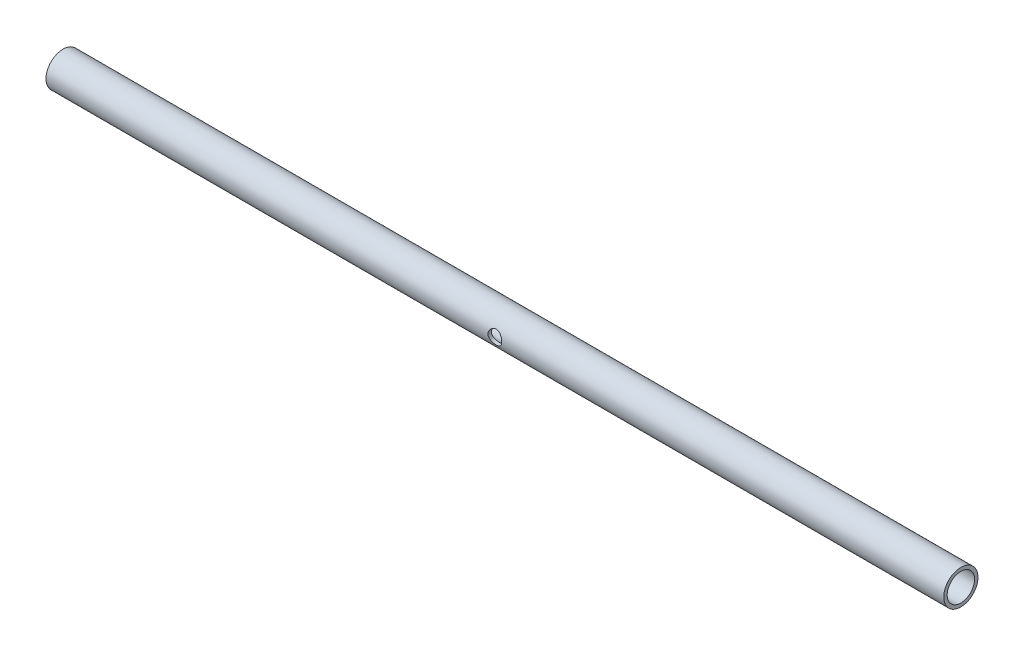
ISO-10303-21;
HEADER;
FILE_DESCRIPTION(('STEP AP214'),'2;1');
FILE_NAME('part.step','',(''),(''),'','','');
FILE_SCHEMA(('AUTOMOTIVE_DESIGN { 1 0 10303 214 1 1 1 1 }'));
ENDSEC;
DATA;
#1=APPLICATION_CONTEXT('core data for automotive mechanical design processes');
#2=APPLICATION_PROTOCOL_DEFINITION('international standard','automotive_design',2000,#1);
#3=PRODUCT_CONTEXT('',#1,'mechanical');
#4=PRODUCT('Part','Part','',(#3));
#5=PRODUCT_RELATED_PRODUCT_CATEGORY('part','',(#4));
#6=PRODUCT_DEFINITION_FORMATION('','',#4);
#7=PRODUCT_DEFINITION_CONTEXT('part definition',#1,'design');
#8=PRODUCT_DEFINITION('design','',#6,#7);
#9=PRODUCT_DEFINITION_SHAPE('','',#8);
#10=(LENGTH_UNIT() NAMED_UNIT(*) SI_UNIT(.MILLI.,.METRE.));
#11=(NAMED_UNIT(*) PLANE_ANGLE_UNIT() SI_UNIT($,.RADIAN.));
#12=(NAMED_UNIT(*) SI_UNIT($,.STERADIAN.) SOLID_ANGLE_UNIT());
#13=UNCERTAINTY_MEASURE_WITH_UNIT(LENGTH_MEASURE(1.E-05),#10,'distance_accuracy_value','');
#14=(GEOMETRIC_REPRESENTATION_CONTEXT(3) GLOBAL_UNCERTAINTY_ASSIGNED_CONTEXT((#13)) GLOBAL_UNIT_ASSIGNED_CONTEXT((#10,
#11,#12)) REPRESENTATION_CONTEXT('',''));
#15=CARTESIAN_POINT('',(0.,0.,0.));
#16=DIRECTION('',(0.,0.,1.));
#17=DIRECTION('',(1.,0.,0.));
#18=AXIS2_PLACEMENT_3D('',#15,#16,#17);
#19=CARTESIAN_POINT('',(131.,0.,0.));
#20=DIRECTION('',(1.,0.,0.));
#21=DIRECTION('',(0.,0.,-1.));
#22=AXIS2_PLACEMENT_3D('',#19,#20,#21);
#23=PLANE('',#22);
#24=CARTESIAN_POINT('',(131.,0.,0.));
#25=DIRECTION('',(1.,0.,0.));
#26=DIRECTION('',(0.,0.,-1.));
#27=AXIS2_PLACEMENT_3D('',#24,#25,#26);
#28=CIRCLE('',#27,5.);
#29=CARTESIAN_POINT('',(131.,0.,-5.));
#30=VERTEX_POINT('',#29);
#31=EDGE_CURVE('E10',#30,#30,#28,.T.);
#32=ORIENTED_EDGE('',*,*,#31,.T.);
#33=EDGE_LOOP('',(#32));
#34=FACE_BOUND('',#33,.T.);
#35=CARTESIAN_POINT('',(131.,0.,0.));
#36=DIRECTION('',(1.,0.,0.));
#37=DIRECTION('',(0.,0.,-1.));
#38=AXIS2_PLACEMENT_3D('',#35,#36,#37);
#39=CIRCLE('',#38,4.);
#40=CARTESIAN_POINT('',(131.,0.,-4.));
#41=VERTEX_POINT('',#40);
#42=EDGE_CURVE('E55',#41,#41,#39,.T.);
#43=ORIENTED_EDGE('',*,*,#42,.F.);
#44=EDGE_LOOP('',(#43));
#45=FACE_BOUND('',#44,.T.);
#46=ADVANCED_FACE('F36',(#34,#45),#23,.T.);
#47=CARTESIAN_POINT('',(-131.,0.,0.));
#48=DIRECTION('',(1.,0.,0.));
#49=DIRECTION('',(0.,0.,-1.));
#50=AXIS2_PLACEMENT_3D('',#47,#48,#49);
#51=PLANE('',#50);
#52=CARTESIAN_POINT('',(-131.,0.,0.));
#53=DIRECTION('',(1.,0.,0.));
#54=DIRECTION('',(0.,0.,-1.));
#55=AXIS2_PLACEMENT_3D('',#52,#53,#54);
#56=CIRCLE('',#55,5.);
#57=CARTESIAN_POINT('',(-131.,0.,-5.));
#58=VERTEX_POINT('',#57);
#59=EDGE_CURVE('E50',#58,#58,#56,.T.);
#60=ORIENTED_EDGE('',*,*,#59,.F.);
#61=EDGE_LOOP('',(#60));
#62=FACE_BOUND('',#61,.T.);
#63=CARTESIAN_POINT('',(-131.,0.,0.));
#64=DIRECTION('',(1.,0.,0.));
#65=DIRECTION('',(0.,0.,-1.));
#66=AXIS2_PLACEMENT_3D('',#63,#64,#65);
#67=CIRCLE('',#66,4.);
#68=CARTESIAN_POINT('',(-131.,0.,-4.));
#69=VERTEX_POINT('',#68);
#70=EDGE_CURVE('E58',#69,#69,#67,.T.);
#71=ORIENTED_EDGE('',*,*,#70,.T.);
#72=EDGE_LOOP('',(#71));
#73=FACE_BOUND('',#72,.T.);
#74=ADVANCED_FACE('F94',(#62,#73),#51,.F.);
#75=CARTESIAN_POINT('',(131.,0.,0.));
#76=DIRECTION('',(-1.,0.,0.));
#77=DIRECTION('',(0.,0.,1.));
#78=AXIS2_PLACEMENT_3D('',#75,#76,#77);
#79=CYLINDRICAL_SURFACE('',#78,5.);
#80=CARTESIAN_POINT('',(2.,0.,-5.));
#81=CARTESIAN_POINT('',(1.99999014817627,0.107493005442891,-4.99999271227085));
#82=CARTESIAN_POINT('',(1.99128224791162,0.215172564090673,-4.99649294306932));
#83=CARTESIAN_POINT('',(1.95675229647876,0.427496480417896,-4.98283453100641));
#84=CARTESIAN_POINT('',(1.93088372091387,0.532131777561248,-4.97265778698877));
#85=CARTESIAN_POINT('',(1.86312392194117,0.734953922727403,-4.94674209213118));
#86=CARTESIAN_POINT('',(1.82128515378327,0.833160661616959,-4.93102136364072));
#87=CARTESIAN_POINT('',(1.72298082667345,1.02107197032837,-4.89556610796078));
#88=CARTESIAN_POINT('',(1.66652034508107,1.11077947675099,-4.87583297458057));
#89=CARTESIAN_POINT('',(1.53776450143906,1.28350100757039,-4.83330886170419));
#90=CARTESIAN_POINT('',(1.46489334375974,1.36606227255021,-4.8104229692919));
#91=CARTESIAN_POINT('',(1.30659999652322,1.51817500478472,-4.76460576906194));
#92=CARTESIAN_POINT('',(1.22117170278826,1.58772010713353,-4.74167444453792));
#93=CARTESIAN_POINT('',(1.03557192975773,1.71487456729288,-4.69722791797136));
#94=CARTESIAN_POINT('',(0.934913513976802,1.77181498119547,-4.67582115964951));
#95=CARTESIAN_POINT('',(0.724463601579958,1.86775471903715,-4.63833647186793));
#96=CARTESIAN_POINT('',(0.614676472151639,1.90676256428583,-4.62225601244176));
#97=CARTESIAN_POINT('',(0.394287666407897,1.96389882339587,-4.59826357660818));
#98=CARTESIAN_POINT('',(0.283948764423787,1.98289396580565,-4.59001420355605));
#99=CARTESIAN_POINT('',(0.0613650016927322,2.00217296164003,-4.58164004049144));
#100=CARTESIAN_POINT('',(-0.0508788946250149,2.00246601631322,-4.58151125522768));
#101=CARTESIAN_POINT('',(-0.265756671458044,1.98498936750454,-4.58910500279994));
#102=CARTESIAN_POINT('',(-0.368515714409031,1.96847531430514,-4.5962817503845));
#103=CARTESIAN_POINT('',(-0.569659556006714,1.91994688029782,-4.61676187607836));
#104=CARTESIAN_POINT('',(-0.668043588110308,1.88792979480463,-4.63006632321673));
#105=CARTESIAN_POINT('',(-0.860017836196041,1.80869473255107,-4.6615948508853));
#106=CARTESIAN_POINT('',(-0.95346923905469,1.76117986231532,-4.67991379280788));
#107=CARTESIAN_POINT('',(-1.13141581636156,1.65250646073221,-4.7193811638989));
#108=CARTESIAN_POINT('',(-1.21590760940281,1.59134280510084,-4.74053065456848));
#109=CARTESIAN_POINT('',(-1.380409728802,1.45155059945443,-4.78526736742271));
#110=CARTESIAN_POINT('',(-1.45956872944602,1.37193746297063,-4.80891664976152));
#111=CARTESIAN_POINT('',(-1.60368447800204,1.20031442743019,-4.85459824958282));
#112=CARTESIAN_POINT('',(-1.66863839741029,1.10830206533443,-4.87663024445325));
#113=CARTESIAN_POINT('',(-1.78361744741583,0.912077652605842,-4.91714681264548));
#114=CARTESIAN_POINT('',(-1.83332228119705,0.807660491346477,-4.93555270095415));
#115=CARTESIAN_POINT('',(-1.91416786107806,0.591023765482882,-4.96614828328759));
#116=CARTESIAN_POINT('',(-1.94531803755741,0.478808196849674,-4.97834113462382));
#117=CARTESIAN_POINT('',(-1.9864482954197,0.25689588760782,-4.99456139506911));
#118=CARTESIAN_POINT('',(-1.99757245425356,0.147443293985535,-4.99902945833514));
#119=CARTESIAN_POINT('',(-2.00171310052861,-0.0718453098078171,-5.00068478510631));
#120=CARTESIAN_POINT('',(-1.99473428154751,-0.181681213223923,-4.99787393582291));
#121=CARTESIAN_POINT('',(-1.96370824744801,-0.393432739121987,-4.98557567063753));
#122=CARTESIAN_POINT('',(-1.94044201964902,-0.495482491775474,-4.97639391345523));
#123=CARTESIAN_POINT('',(-1.87856429169019,-0.69413542806078,-4.952594414055));
#124=CARTESIAN_POINT('',(-1.83995082033132,-0.790737910224844,-4.9379759735653));
#125=CARTESIAN_POINT('',(-1.74721506032005,-0.979078785816702,-4.90416594770812));
#126=CARTESIAN_POINT('',(-1.69265452795685,-1.07057802275541,-4.88484815979804));
#127=CARTESIAN_POINT('',(-1.57005967609436,-1.24344359124656,-4.84373364745525));
#128=CARTESIAN_POINT('',(-1.50201995707739,-1.32480584076113,-4.8219359311027));
#129=CARTESIAN_POINT('',(-1.34912998705037,-1.48072304302882,-4.77645117638112));
#130=CARTESIAN_POINT('',(-1.26346645849379,-1.55447393380606,-4.75273441425052));
#131=CARTESIAN_POINT('',(-1.08055991699063,-1.68675119741371,-4.70741672917132));
#132=CARTESIAN_POINT('',(-0.983314999660052,-1.74527506133751,-4.68581615526511));
#133=CARTESIAN_POINT('',(-0.778538305405895,-1.84580750193163,-4.64714299907709));
#134=CARTESIAN_POINT('',(-0.67091600078769,-1.88765059453445,-4.63011630884788));
#135=CARTESIAN_POINT('',(-0.449266348284846,-1.9522962197053,-4.60323673477931));
#136=CARTESIAN_POINT('',(-0.335243794187575,-1.97511280526931,-4.59337855695998));
#137=CARTESIAN_POINT('',(-0.112872098225457,-1.9997156172784,-4.58271759299926));
#138=CARTESIAN_POINT('',(-0.0047051604066488,-2.00289708230287,-4.58131421008171));
#139=CARTESIAN_POINT('',(0.210544857713294,-1.99180315927752,-4.58614836033098));
#140=CARTESIAN_POINT('',(0.317628073902584,-1.97752998791378,-4.59238492324794));
#141=CARTESIAN_POINT('',(0.523332189855041,-1.93307136615365,-4.61126649079021));
#142=CARTESIAN_POINT('',(0.622120274432998,-1.90353749357098,-4.62364831827449));
#143=CARTESIAN_POINT('',(0.813378629613482,-1.83000544849101,-4.65324001232696));
#144=CARTESIAN_POINT('',(0.905847146899825,-1.78600328139381,-4.67045121206007));
#145=CARTESIAN_POINT('',(1.08760961927078,-1.68187276275973,-4.70898609604491));
#146=CARTESIAN_POINT('',(1.17641867013048,-1.62096533515949,-4.73048882313242));
#147=CARTESIAN_POINT('',(1.34299331720375,-1.4858921192715,-4.77463804372237));
#148=CARTESIAN_POINT('',(1.42075557212831,-1.41172233481812,-4.79728488048406));
#149=CARTESIAN_POINT('',(1.56820285326361,-1.24650550627246,-4.84293567087394));
#150=CARTESIAN_POINT('',(1.63703730689807,-1.15467600114614,-4.86586757962185));
#151=CARTESIAN_POINT('',(1.75833704262164,-0.959900320285779,-4.90800406713717));
#152=CARTESIAN_POINT('',(1.81079471215253,-0.856949004547237,-4.92720691092906));
#153=CARTESIAN_POINT('',(1.89662221519029,-0.644738062495203,-4.95939714815861));
#154=CARTESIAN_POINT('',(1.93032932356034,-0.535631618219697,-4.97249363055028));
#155=CARTESIAN_POINT('',(1.97863912095427,-0.312876546281222,-4.99144306209366));
#156=CARTESIAN_POINT('',(1.9933024367439,-0.199243525858913,-4.99731899495638));
#157=CARTESIAN_POINT('',(1.99939538097827,-0.05691229789093,-4.99975899504136));
#158=CARTESIAN_POINT('',(2.00000260862919,-0.0284626887407585,-5.00000192969176));
#159=CARTESIAN_POINT('',(2.,0.,-5.));
#160=B_SPLINE_CURVE_WITH_KNOTS('',3,(#80,#81,#82,#83,#84,#85,#86,#87,#88,#89,#90,#91,#92,#93,
#94,#95,#96,#97,#98,#99,#100,#101,#102,#103,#104,#105,#106,#107,#108,#109,#110,#111,#112,#113,
#114,#115,#116,#117,#118,#119,#120,#121,#122,#123,#124,#125,#126,#127,#128,#129,#130,#131,#132,
#133,#134,#135,#136,#137,#138,#139,#140,#141,#142,#143,#144,#145,#146,#147,#148,#149,#150,#151,
#152,#153,#154,#155,#156,#157,#158,#159),.UNSPECIFIED.,.T.,.F.,(4,2,2,2,2,2,2,2,2,2,2,2,2,2,2,2,
2,2,2,2,2,2,2,2,2,2,2,2,2,2,2,2,2,2,2,2,2,2,2,4),(0.,0.322402987893071,0.645683636007934,
0.967911457471581,1.29002753567984,1.62597381700397,1.96208394934411,2.31315258819217,
2.66405423118268,2.99904105308829,3.33386306340488,3.64538328401372,3.95695787256047,
4.27489126298816,4.59294421938183,4.93558349186557,5.27829092839733,5.62776913162806,
5.9770695611379,6.30569184528007,6.63422893570082,6.94800455564365,7.26182048993797,
7.58523513398263,7.90877959498969,8.25368474624414,8.59864669043748,8.94695045140827,
9.29499672645934,9.61799673392748,9.94095572563046,10.2511431854877,10.5614163580516,
10.8894546805669,11.2175920134839,11.5670042353384,11.9165786364053,12.2596430101332,
12.6016125240434,12.686980458968),.UNSPECIFIED.);
#161=CARTESIAN_POINT('',(2.,0.,-5.));
#162=VERTEX_POINT('',#161);
#163=EDGE_CURVE('E83',#162,#162,#160,.T.);
#164=ORIENTED_EDGE('',*,*,#163,.T.);
#165=EDGE_LOOP('',(#164));
#166=FACE_BOUND('',#165,.T.);
#167=CARTESIAN_POINT('',(2.,0.,5.));
#168=CARTESIAN_POINT('',(1.99999014817627,-0.107493005442891,4.99999271227085));
#169=CARTESIAN_POINT('',(1.99128224791162,-0.215172564090673,4.99649294306932));
#170=CARTESIAN_POINT('',(1.95675229647876,-0.427496480417896,4.98283453100641));
#171=CARTESIAN_POINT('',(1.93088372091387,-0.532131777561248,4.97265778698877));
#172=CARTESIAN_POINT('',(1.86312392194117,-0.734953922727403,4.94674209213118));
#173=CARTESIAN_POINT('',(1.82128515378327,-0.833160661616959,4.93102136364072));
#174=CARTESIAN_POINT('',(1.72298082667345,-1.02107197032837,4.89556610796078));
#175=CARTESIAN_POINT('',(1.66652034508107,-1.11077947675099,4.87583297458057));
#176=CARTESIAN_POINT('',(1.53776450143906,-1.28350100757039,4.83330886170419));
#177=CARTESIAN_POINT('',(1.46489334375974,-1.36606227255021,4.8104229692919));
#178=CARTESIAN_POINT('',(1.30659999652322,-1.51817500478472,4.76460576906194));
#179=CARTESIAN_POINT('',(1.22117170278826,-1.58772010713353,4.74167444453792));
#180=CARTESIAN_POINT('',(1.03557192975773,-1.71487456729288,4.69722791797136));
#181=CARTESIAN_POINT('',(0.934913513976802,-1.77181498119547,4.67582115964951));
#182=CARTESIAN_POINT('',(0.724463601579958,-1.86775471903715,4.63833647186793));
#183=CARTESIAN_POINT('',(0.614676472151639,-1.90676256428583,4.62225601244176));
#184=CARTESIAN_POINT('',(0.394287666407897,-1.96389882339587,4.59826357660818));
#185=CARTESIAN_POINT('',(0.283948764423787,-1.98289396580565,4.59001420355605));
#186=CARTESIAN_POINT('',(0.0613650016927322,-2.00217296164003,4.58164004049144));
#187=CARTESIAN_POINT('',(-0.0508788946250149,-2.00246601631322,4.58151125522768));
#188=CARTESIAN_POINT('',(-0.265756671458044,-1.98498936750454,4.58910500279994));
#189=CARTESIAN_POINT('',(-0.368515714409031,-1.96847531430514,4.5962817503845));
#190=CARTESIAN_POINT('',(-0.569659556006714,-1.91994688029782,4.61676187607836));
#191=CARTESIAN_POINT('',(-0.668043588110308,-1.88792979480463,4.63006632321673));
#192=CARTESIAN_POINT('',(-0.860017836196041,-1.80869473255107,4.6615948508853));
#193=CARTESIAN_POINT('',(-0.95346923905469,-1.76117986231532,4.67991379280788));
#194=CARTESIAN_POINT('',(-1.13141581636156,-1.65250646073221,4.7193811638989));
#195=CARTESIAN_POINT('',(-1.21590760940281,-1.59134280510084,4.74053065456848));
#196=CARTESIAN_POINT('',(-1.380409728802,-1.45155059945443,4.78526736742271));
#197=CARTESIAN_POINT('',(-1.45956872944602,-1.37193746297063,4.80891664976152));
#198=CARTESIAN_POINT('',(-1.60368447800204,-1.20031442743019,4.85459824958282));
#199=CARTESIAN_POINT('',(-1.66863839741029,-1.10830206533443,4.87663024445325));
#200=CARTESIAN_POINT('',(-1.78361744741583,-0.912077652605842,4.91714681264548));
#201=CARTESIAN_POINT('',(-1.83332228119705,-0.807660491346477,4.93555270095415));
#202=CARTESIAN_POINT('',(-1.91416786107806,-0.591023765482882,4.96614828328759));
#203=CARTESIAN_POINT('',(-1.94531803755741,-0.478808196849674,4.97834113462382));
#204=CARTESIAN_POINT('',(-1.9864482954197,-0.25689588760782,4.99456139506911));
#205=CARTESIAN_POINT('',(-1.99757245425356,-0.147443293985535,4.99902945833514));
#206=CARTESIAN_POINT('',(-2.00171310052861,0.0718453098078171,5.00068478510631));
#207=CARTESIAN_POINT('',(-1.99473428154751,0.181681213223923,4.99787393582291));
#208=CARTESIAN_POINT('',(-1.96370824744801,0.393432739121987,4.98557567063753));
#209=CARTESIAN_POINT('',(-1.94044201964902,0.495482491775474,4.97639391345523));
#210=CARTESIAN_POINT('',(-1.87856429169019,0.69413542806078,4.952594414055));
#211=CARTESIAN_POINT('',(-1.83995082033132,0.790737910224844,4.9379759735653));
#212=CARTESIAN_POINT('',(-1.74721506032005,0.979078785816702,4.90416594770812));
#213=CARTESIAN_POINT('',(-1.69265452795685,1.07057802275541,4.88484815979804));
#214=CARTESIAN_POINT('',(-1.57005967609436,1.24344359124656,4.84373364745525));
#215=CARTESIAN_POINT('',(-1.50201995707739,1.32480584076113,4.8219359311027));
#216=CARTESIAN_POINT('',(-1.34912998705037,1.48072304302882,4.77645117638112));
#217=CARTESIAN_POINT('',(-1.26346645849379,1.55447393380606,4.75273441425052));
#218=CARTESIAN_POINT('',(-1.08055991699063,1.68675119741371,4.70741672917132));
#219=CARTESIAN_POINT('',(-0.983314999660052,1.74527506133751,4.68581615526511));
#220=CARTESIAN_POINT('',(-0.778538305405895,1.84580750193163,4.64714299907709));
#221=CARTESIAN_POINT('',(-0.67091600078769,1.88765059453445,4.63011630884788));
#222=CARTESIAN_POINT('',(-0.449266348284846,1.9522962197053,4.60323673477931));
#223=CARTESIAN_POINT('',(-0.335243794187575,1.97511280526931,4.59337855695998));
#224=CARTESIAN_POINT('',(-0.112872098225457,1.9997156172784,4.58271759299926));
#225=CARTESIAN_POINT('',(-0.0047051604066488,2.00289708230287,4.58131421008171));
#226=CARTESIAN_POINT('',(0.210544857713294,1.99180315927752,4.58614836033098));
#227=CARTESIAN_POINT('',(0.317628073902584,1.97752998791378,4.59238492324794));
#228=CARTESIAN_POINT('',(0.523332189855041,1.93307136615365,4.61126649079021));
#229=CARTESIAN_POINT('',(0.622120274432998,1.90353749357098,4.62364831827449));
#230=CARTESIAN_POINT('',(0.813378629613482,1.83000544849101,4.65324001232696));
#231=CARTESIAN_POINT('',(0.905847146899825,1.78600328139381,4.67045121206007));
#232=CARTESIAN_POINT('',(1.08760961927078,1.68187276275973,4.70898609604491));
#233=CARTESIAN_POINT('',(1.17641867013048,1.62096533515949,4.73048882313242));
#234=CARTESIAN_POINT('',(1.34299331720375,1.4858921192715,4.77463804372237));
#235=CARTESIAN_POINT('',(1.42075557212831,1.41172233481812,4.79728488048406));
#236=CARTESIAN_POINT('',(1.56820285326361,1.24650550627246,4.84293567087394));
#237=CARTESIAN_POINT('',(1.63703730689807,1.15467600114614,4.86586757962185));
#238=CARTESIAN_POINT('',(1.75833704262164,0.959900320285779,4.90800406713717));
#239=CARTESIAN_POINT('',(1.81079471215253,0.856949004547237,4.92720691092906));
#240=CARTESIAN_POINT('',(1.89662221519029,0.644738062495203,4.95939714815861));
#241=CARTESIAN_POINT('',(1.93032932356034,0.535631618219697,4.97249363055028));
#242=CARTESIAN_POINT('',(1.97863912095427,0.312876546281222,4.99144306209366));
#243=CARTESIAN_POINT('',(1.9933024367439,0.199243525858913,4.99731899495638));
#244=CARTESIAN_POINT('',(1.99939538097827,0.05691229789093,4.99975899504136));
#245=CARTESIAN_POINT('',(2.00000260862919,0.0284626887407585,5.00000192969176));
#246=CARTESIAN_POINT('',(2.,0.,5.));
#247=B_SPLINE_CURVE_WITH_KNOTS('',3,(#167,#168,#169,#170,#171,#172,#173,#174,#175,#176,#177,
#178,#179,#180,#181,#182,#183,#184,#185,#186,#187,#188,#189,#190,#191,#192,#193,#194,#195,#196,
#197,#198,#199,#200,#201,#202,#203,#204,#205,#206,#207,#208,#209,#210,#211,#212,#213,#214,#215,
#216,#217,#218,#219,#220,#221,#222,#223,#224,#225,#226,#227,#228,#229,#230,#231,#232,#233,#234,
#235,#236,#237,#238,#239,#240,#241,#242,#243,#244,#245,#246),.UNSPECIFIED.,.T.,.F.,(4,2,2,2,2,2,
2,2,2,2,2,2,2,2,2,2,2,2,2,2,2,2,2,2,2,2,2,2,2,2,2,2,2,2,2,2,2,2,2,4),(0.,0.322402987893071,
0.645683636007934,0.967911457471581,1.29002753567984,1.62597381700397,1.96208394934411,
2.31315258819217,2.66405423118268,2.99904105308829,3.33386306340488,3.64538328401372,
3.95695787256047,4.27489126298816,4.59294421938183,4.93558349186557,5.27829092839733,
5.62776913162806,5.9770695611379,6.30569184528007,6.63422893570082,6.94800455564365,
7.26182048993797,7.58523513398263,7.90877959498969,8.25368474624414,8.59864669043748,
8.94695045140827,9.29499672645934,9.61799673392748,9.94095572563046,10.2511431854877,
10.5614163580516,10.8894546805669,11.2175920134839,11.5670042353384,11.9165786364053,
12.2596430101332,12.6016125240434,12.686980458968),.UNSPECIFIED.);
#248=CARTESIAN_POINT('',(2.,0.,5.));
#249=VERTEX_POINT('',#248);
#250=EDGE_CURVE('E78',#249,#249,#247,.T.);
#251=ORIENTED_EDGE('',*,*,#250,.T.);
#252=EDGE_LOOP('',(#251));
#253=FACE_BOUND('',#252,.T.);
#254=ORIENTED_EDGE('',*,*,#31,.F.);
#255=EDGE_LOOP('',(#254));
#256=FACE_BOUND('',#255,.T.);
#257=ORIENTED_EDGE('',*,*,#59,.T.);
#258=EDGE_LOOP('',(#257));
#259=FACE_BOUND('',#258,.T.);
#260=ADVANCED_FACE('F38',(#166,#253,#256,#259),#79,.T.);
#261=CARTESIAN_POINT('',(131.,0.,0.));
#262=DIRECTION('',(-1.,0.,0.));
#263=DIRECTION('',(0.,0.,1.));
#264=AXIS2_PLACEMENT_3D('',#261,#262,#263);
#265=CYLINDRICAL_SURFACE('',#264,4.);
#266=CARTESIAN_POINT('',(2.,0.,4.));
#267=CARTESIAN_POINT('',(1.99999339536562,-0.105143925902467,3.99999426810082));
#268=CARTESIAN_POINT('',(1.99165985375789,-0.210413199395125,3.99580982039513));
#269=CARTESIAN_POINT('',(1.95869423931692,-0.417840470537792,3.97948312074314));
#270=CARTESIAN_POINT('',(1.93403121400437,-0.519992173427259,3.96732575657839));
#271=CARTESIAN_POINT('',(1.86961238276674,-0.717867089760898,3.93632558806751));
#272=CARTESIAN_POINT('',(1.82991523150406,-0.813613605878292,3.91750878355075));
#273=CARTESIAN_POINT('',(1.73685875727003,-0.996945233613197,3.87491553031523));
#274=CARTESIAN_POINT('',(1.68350051150227,-1.08453098798012,3.8511394726705));
#275=CARTESIAN_POINT('',(1.56096550102943,-1.25501563552382,3.79912516516124));
#276=CARTESIAN_POINT('',(1.49102704152072,-1.33731042224422,3.77070398255074));
#277=CARTESIAN_POINT('',(1.33895704150593,-1.48955888973396,3.71319940493486));
#278=CARTESIAN_POINT('',(1.25681629645512,-1.55950316621353,3.68411552418069));
#279=CARTESIAN_POINT('',(1.07503330095324,-1.69050400090056,3.62597902394695));
#280=CARTESIAN_POINT('',(0.974527803308175,-1.75045067110327,3.59710373940264));
#281=CARTESIAN_POINT('',(0.763265328027571,-1.85233645378139,3.54571957544641));
#282=CARTESIAN_POINT('',(0.652515742554502,-1.89428842993267,3.52320615213979));
#283=CARTESIAN_POINT('',(0.430669789156155,-1.95626488437718,3.48915734075617));
#284=CARTESIAN_POINT('',(0.319991095865212,-1.97745171416088,3.47704543167427));
#285=CARTESIAN_POINT('',(0.0960423244410466,-2.00085398661769,3.46363779897055));
#286=CARTESIAN_POINT('',(-0.0172250817423092,-2.00308817674615,3.46233138686576));
#287=CARTESIAN_POINT('',(-0.228572048630736,-1.98937457434459,3.47021860514497));
#288=CARTESIAN_POINT('',(-0.3268480624461,-1.97556911907364,3.47817527324027));
#289=CARTESIAN_POINT('',(-0.519443818746084,-1.93387969811386,3.50152457467701));
#290=CARTESIAN_POINT('',(-0.613762290610631,-1.9059912477953,3.51691957663553));
#291=CARTESIAN_POINT('',(-0.798458265131318,-1.83641956077201,3.55374952825482));
#292=CARTESIAN_POINT('',(-0.888692797571577,-1.79443013423199,3.57531681327997));
#293=CARTESIAN_POINT('',(-1.06126858518002,-1.698083375336,3.62206808562807));
#294=CARTESIAN_POINT('',(-1.14360627120018,-1.64372048762493,3.64725369560381));
#295=CARTESIAN_POINT('',(-1.30904250548645,-1.51613210982558,3.70226315806572));
#296=CARTESIAN_POINT('',(-1.39091374715231,-1.44138891673856,3.73227020473492));
#297=CARTESIAN_POINT('',(-1.5414708371818,-1.27911115748275,3.79095246600814));
#298=CARTESIAN_POINT('',(-1.61015038406777,-1.19157051314857,3.81962703917602));
#299=CARTESIAN_POINT('',(-1.73537132205945,-1.0010330116637,3.87403974565928));
#300=CARTESIAN_POINT('',(-1.79120094489148,-0.897507183198818,3.89957968324015));
#301=CARTESIAN_POINT('',(-1.88419405808602,-0.680932430977594,3.94315762242485));
#302=CARTESIAN_POINT('',(-1.92137237003033,-0.567891152530552,3.96120157887106));
#303=CARTESIAN_POINT('',(-1.97295080743335,-0.345532983321405,3.98648667482871));
#304=CARTESIAN_POINT('',(-1.98898247149356,-0.236683061096652,3.9944987660262));
#305=CARTESIAN_POINT('',(-2.00292946226897,-0.0175591998987033,4.00146026918207));
#306=CARTESIAN_POINT('',(-2.00085337127894,0.0927140397398172,4.00041397442637));
#307=CARTESIAN_POINT('',(-1.97958662316251,0.302465943971974,3.9898238450687));
#308=CARTESIAN_POINT('',(-1.96173493454001,0.40211881609986,3.98094491376337));
#309=CARTESIAN_POINT('',(-1.91152385620976,0.596813784603882,3.9564434262968));
#310=CARTESIAN_POINT('',(-1.87916286709301,0.691855371382174,3.94082012668824));
#311=CARTESIAN_POINT('',(-1.80000306713393,0.877777216899145,3.90368502827176));
#312=CARTESIAN_POINT('',(-1.75281789976743,0.968460794011607,3.88201763539261));
#313=CARTESIAN_POINT('',(-1.64578492870686,1.14092272339854,3.83487948634835));
#314=CARTESIAN_POINT('',(-1.58593173080921,1.22269725955318,3.80940711133877));
#315=CARTESIAN_POINT('',(-1.44847914933857,1.38353537857843,3.75416442672396));
#316=CARTESIAN_POINT('',(-1.36971426310971,1.46154415563805,3.72421769686998));
#317=CARTESIAN_POINT('',(-1.20014969744454,1.60371264223771,3.6652478321764));
#318=CARTESIAN_POINT('',(-1.10934176230416,1.66786277142375,3.63622534800094));
#319=CARTESIAN_POINT('',(-0.912712691654048,1.78341582895804,3.58102384412979));
#320=CARTESIAN_POINT('',(-0.806377467811037,1.8340509916005,3.55505059178121));
#321=CARTESIAN_POINT('',(-0.584979864850068,1.91616565186941,3.51148144588269));
#322=CARTESIAN_POINT('',(-0.469928947066219,1.94766983173403,3.493874764435));
#323=CARTESIAN_POINT('',(-0.246179554230592,1.98772337493374,3.47123002051604));
#324=CARTESIAN_POINT('',(-0.137931493129517,1.9981859928109,3.4651476693013));
#325=CARTESIAN_POINT('',(0.0788941343290494,2.0013783087524,3.46330709283206));
#326=CARTESIAN_POINT('',(0.187471537475723,1.99411569324648,3.4675443925278));
#327=CARTESIAN_POINT('',(0.390967003066874,1.96385225118662,3.48475724102153));
#328=CARTESIAN_POINT('',(0.486200940289479,1.94241662868607,3.49686188965317));
#329=CARTESIAN_POINT('',(0.671616238848733,1.88635071644882,3.52742032375305));
#330=CARTESIAN_POINT('',(0.761795964184063,1.85171618231984,3.54587615139337));
#331=CARTESIAN_POINT('',(0.941249701973074,1.76763149060113,3.58857060729071));
#332=CARTESIAN_POINT('',(1.03005580365806,1.7173422756314,3.61311444791841));
#333=CARTESIAN_POINT('',(1.19854907236252,1.60430194327478,3.66470663269721));
#334=CARTESIAN_POINT('',(1.27823146104222,1.54154434248312,3.69175627591221));
#335=CARTESIAN_POINT('',(1.43628396470935,1.39640665332275,3.74924646316184));
#336=CARTESIAN_POINT('',(1.51331820470058,1.31256884599452,3.77969966613256));
#337=CARTESIAN_POINT('',(1.65252596687054,1.13230961246639,3.83755504519861));
#338=CARTESIAN_POINT('',(1.71469147893981,1.03588144661039,3.8649555725239));
#339=CARTESIAN_POINT('',(1.82247272542414,0.831863193565891,3.91396019133075));
#340=CARTESIAN_POINT('',(1.86796833847294,0.72419900755346,3.93552192987866));
#341=CARTESIAN_POINT('',(1.93961633551482,0.501484202276172,3.97002682597974));
#342=CARTESIAN_POINT('',(1.96582369361143,0.3864555991782,3.98299446726136));
#343=CARTESIAN_POINT('',(1.98779482217148,0.22520389298179,3.99390923826956));
#344=CARTESIAN_POINT('',(1.99236528173268,0.18032375888313,3.99618730680502));
#345=CARTESIAN_POINT('',(1.99846933102817,0.0903034636101831,3.99923393953631));
#346=CARTESIAN_POINT('',(2.00000283694042,0.0451632952932568,4.00000246206762));
#347=CARTESIAN_POINT('',(2.,0.,4.));
#348=B_SPLINE_CURVE_WITH_KNOTS('',3,(#266,#267,#268,#269,#270,#271,#272,#273,#274,#275,#276,
#277,#278,#279,#280,#281,#282,#283,#284,#285,#286,#287,#288,#289,#290,#291,#292,#293,#294,#295,
#296,#297,#298,#299,#300,#301,#302,#303,#304,#305,#306,#307,#308,#309,#310,#311,#312,#313,#314,
#315,#316,#317,#318,#319,#320,#321,#322,#323,#324,#325,#326,#327,#328,#329,#330,#331,#332,#333,
#334,#335,#336,#337,#338,#339,#340,#341,#342,#343,#344,#345,#346,#347),.UNSPECIFIED.,.T.,.F.,(4,
2,2,2,2,2,2,2,2,2,2,2,2,2,2,2,2,2,2,2,2,2,2,2,2,2,2,2,2,2,2,2,2,2,2,2,2,2,2,2,4),(0.,
0.315248514840585,0.631096299418395,0.945724310984597,1.26032752116314,1.59396351743618,
1.92785247530807,2.28763452861505,2.64715895796562,2.98516024280459,3.32282714658041,
3.62011424818641,3.91749607851357,4.22180480336975,4.52625042520444,4.86929882667757,
5.21251069197373,5.57166044428881,5.93052433824559,6.25966580942691,6.58865129022952,
6.89213813012244,7.19565843261863,7.50785712055797,7.82018901496679,8.16319221288838,
8.50643177230864,8.86629364323452,9.22569023890902,9.55058615006093,9.87534119729357,
10.1691586049771,10.463070575767,10.7767291356057,11.0905512228726,11.4425048551434,
11.7946476676249,12.1492802732705,12.502898172423,12.6383056026783,12.7737167702213),.UNSPECIFIED.);
#349=CARTESIAN_POINT('',(2.,0.,4.));
#350=VERTEX_POINT('',#349);
#351=EDGE_CURVE('E41',#350,#350,#348,.T.);
#352=ORIENTED_EDGE('',*,*,#351,.F.);
#353=EDGE_LOOP('',(#352));
#354=FACE_BOUND('',#353,.T.);
#355=CARTESIAN_POINT('',(2.,0.,-4.));
#356=CARTESIAN_POINT('',(1.99999339536562,0.105143925902467,-3.99999426810082));
#357=CARTESIAN_POINT('',(1.99165985375789,0.210413199395125,-3.99580982039513));
#358=CARTESIAN_POINT('',(1.95869423931692,0.417840470537792,-3.97948312074314));
#359=CARTESIAN_POINT('',(1.93403121400437,0.519992173427259,-3.96732575657839));
#360=CARTESIAN_POINT('',(1.86961238276674,0.717867089760898,-3.93632558806751));
#361=CARTESIAN_POINT('',(1.82991523150406,0.813613605878292,-3.91750878355075));
#362=CARTESIAN_POINT('',(1.73685875727003,0.996945233613197,-3.87491553031523));
#363=CARTESIAN_POINT('',(1.68350051150227,1.08453098798012,-3.8511394726705));
#364=CARTESIAN_POINT('',(1.56096550102943,1.25501563552382,-3.79912516516124));
#365=CARTESIAN_POINT('',(1.49102704152072,1.33731042224422,-3.77070398255074));
#366=CARTESIAN_POINT('',(1.33895704150593,1.48955888973396,-3.71319940493486));
#367=CARTESIAN_POINT('',(1.25681629645512,1.55950316621353,-3.68411552418069));
#368=CARTESIAN_POINT('',(1.07503330095324,1.69050400090056,-3.62597902394695));
#369=CARTESIAN_POINT('',(0.974527803308175,1.75045067110327,-3.59710373940264));
#370=CARTESIAN_POINT('',(0.763265328027571,1.85233645378139,-3.54571957544641));
#371=CARTESIAN_POINT('',(0.652515742554502,1.89428842993267,-3.52320615213979));
#372=CARTESIAN_POINT('',(0.430669789156155,1.95626488437718,-3.48915734075617));
#373=CARTESIAN_POINT('',(0.319991095865212,1.97745171416088,-3.47704543167427));
#374=CARTESIAN_POINT('',(0.0960423244410466,2.00085398661769,-3.46363779897055));
#375=CARTESIAN_POINT('',(-0.0172250817423092,2.00308817674615,-3.46233138686576));
#376=CARTESIAN_POINT('',(-0.228572048630736,1.98937457434459,-3.47021860514497));
#377=CARTESIAN_POINT('',(-0.3268480624461,1.97556911907364,-3.47817527324027));
#378=CARTESIAN_POINT('',(-0.519443818746084,1.93387969811386,-3.50152457467701));
#379=CARTESIAN_POINT('',(-0.613762290610631,1.9059912477953,-3.51691957663553));
#380=CARTESIAN_POINT('',(-0.798458265131318,1.83641956077201,-3.55374952825482));
#381=CARTESIAN_POINT('',(-0.888692797571577,1.79443013423199,-3.57531681327997));
#382=CARTESIAN_POINT('',(-1.06126858518002,1.698083375336,-3.62206808562807));
#383=CARTESIAN_POINT('',(-1.14360627120018,1.64372048762493,-3.64725369560381));
#384=CARTESIAN_POINT('',(-1.30904250548645,1.51613210982558,-3.70226315806572));
#385=CARTESIAN_POINT('',(-1.39091374715231,1.44138891673856,-3.73227020473492));
#386=CARTESIAN_POINT('',(-1.5414708371818,1.27911115748275,-3.79095246600814));
#387=CARTESIAN_POINT('',(-1.61015038406777,1.19157051314857,-3.81962703917602));
#388=CARTESIAN_POINT('',(-1.73537132205945,1.0010330116637,-3.87403974565928));
#389=CARTESIAN_POINT('',(-1.79120094489148,0.897507183198818,-3.89957968324015));
#390=CARTESIAN_POINT('',(-1.88419405808602,0.680932430977594,-3.94315762242485));
#391=CARTESIAN_POINT('',(-1.92137237003033,0.567891152530552,-3.96120157887106));
#392=CARTESIAN_POINT('',(-1.97295080743335,0.345532983321405,-3.98648667482871));
#393=CARTESIAN_POINT('',(-1.98898247149356,0.236683061096652,-3.9944987660262));
#394=CARTESIAN_POINT('',(-2.00292946226897,0.0175591998987033,-4.00146026918207));
#395=CARTESIAN_POINT('',(-2.00085337127894,-0.0927140397398172,-4.00041397442637));
#396=CARTESIAN_POINT('',(-1.97958662316251,-0.302465943971974,-3.9898238450687));
#397=CARTESIAN_POINT('',(-1.96173493454001,-0.40211881609986,-3.98094491376337));
#398=CARTESIAN_POINT('',(-1.91152385620976,-0.596813784603882,-3.9564434262968));
#399=CARTESIAN_POINT('',(-1.87916286709301,-0.691855371382174,-3.94082012668824));
#400=CARTESIAN_POINT('',(-1.80000306713393,-0.877777216899145,-3.90368502827176));
#401=CARTESIAN_POINT('',(-1.75281789976743,-0.968460794011607,-3.88201763539261));
#402=CARTESIAN_POINT('',(-1.64578492870686,-1.14092272339854,-3.83487948634835));
#403=CARTESIAN_POINT('',(-1.58593173080921,-1.22269725955318,-3.80940711133877));
#404=CARTESIAN_POINT('',(-1.44847914933857,-1.38353537857843,-3.75416442672396));
#405=CARTESIAN_POINT('',(-1.36971426310971,-1.46154415563805,-3.72421769686998));
#406=CARTESIAN_POINT('',(-1.20014969744454,-1.60371264223771,-3.6652478321764));
#407=CARTESIAN_POINT('',(-1.10934176230416,-1.66786277142375,-3.63622534800094));
#408=CARTESIAN_POINT('',(-0.912712691654048,-1.78341582895804,-3.58102384412979));
#409=CARTESIAN_POINT('',(-0.806377467811037,-1.8340509916005,-3.55505059178121));
#410=CARTESIAN_POINT('',(-0.584979864850068,-1.91616565186941,-3.51148144588269));
#411=CARTESIAN_POINT('',(-0.469928947066219,-1.94766983173403,-3.493874764435));
#412=CARTESIAN_POINT('',(-0.246179554230592,-1.98772337493374,-3.47123002051604));
#413=CARTESIAN_POINT('',(-0.137931493129517,-1.9981859928109,-3.4651476693013));
#414=CARTESIAN_POINT('',(0.0788941343290494,-2.0013783087524,-3.46330709283206));
#415=CARTESIAN_POINT('',(0.187471537475723,-1.99411569324648,-3.4675443925278));
#416=CARTESIAN_POINT('',(0.390967003066874,-1.96385225118662,-3.48475724102153));
#417=CARTESIAN_POINT('',(0.486200940289479,-1.94241662868607,-3.49686188965317));
#418=CARTESIAN_POINT('',(0.671616238848733,-1.88635071644882,-3.52742032375305));
#419=CARTESIAN_POINT('',(0.761795964184063,-1.85171618231984,-3.54587615139337));
#420=CARTESIAN_POINT('',(0.941249701973074,-1.76763149060113,-3.58857060729071));
#421=CARTESIAN_POINT('',(1.03005580365806,-1.7173422756314,-3.61311444791841));
#422=CARTESIAN_POINT('',(1.19854907236252,-1.60430194327478,-3.66470663269721));
#423=CARTESIAN_POINT('',(1.27823146104222,-1.54154434248312,-3.69175627591221));
#424=CARTESIAN_POINT('',(1.43628396470935,-1.39640665332275,-3.74924646316184));
#425=CARTESIAN_POINT('',(1.51331820470058,-1.31256884599452,-3.77969966613256));
#426=CARTESIAN_POINT('',(1.65252596687054,-1.13230961246639,-3.83755504519861));
#427=CARTESIAN_POINT('',(1.71469147893981,-1.03588144661039,-3.8649555725239));
#428=CARTESIAN_POINT('',(1.82247272542414,-0.831863193565891,-3.91396019133075));
#429=CARTESIAN_POINT('',(1.86796833847294,-0.72419900755346,-3.93552192987866));
#430=CARTESIAN_POINT('',(1.93961633551482,-0.501484202276172,-3.97002682597974));
#431=CARTESIAN_POINT('',(1.96582369361143,-0.3864555991782,-3.98299446726136));
#432=CARTESIAN_POINT('',(1.98779482217148,-0.22520389298179,-3.99390923826956));
#433=CARTESIAN_POINT('',(1.99236528173268,-0.18032375888313,-3.99618730680502));
#434=CARTESIAN_POINT('',(1.99846933102817,-0.0903034636101831,-3.99923393953631));
#435=CARTESIAN_POINT('',(2.00000283694042,-0.0451632952932568,-4.00000246206762));
#436=CARTESIAN_POINT('',(2.,0.,-4.));
#437=B_SPLINE_CURVE_WITH_KNOTS('',3,(#355,#356,#357,#358,#359,#360,#361,#362,#363,#364,#365,
#366,#367,#368,#369,#370,#371,#372,#373,#374,#375,#376,#377,#378,#379,#380,#381,#382,#383,#384,
#385,#386,#387,#388,#389,#390,#391,#392,#393,#394,#395,#396,#397,#398,#399,#400,#401,#402,#403,
#404,#405,#406,#407,#408,#409,#410,#411,#412,#413,#414,#415,#416,#417,#418,#419,#420,#421,#422,
#423,#424,#425,#426,#427,#428,#429,#430,#431,#432,#433,#434,#435,#436),.UNSPECIFIED.,.T.,.F.,(4,
2,2,2,2,2,2,2,2,2,2,2,2,2,2,2,2,2,2,2,2,2,2,2,2,2,2,2,2,2,2,2,2,2,2,2,2,2,2,2,4),(0.,
0.315248514840585,0.631096299418395,0.945724310984597,1.26032752116314,1.59396351743618,
1.92785247530807,2.28763452861505,2.64715895796562,2.98516024280459,3.32282714658041,
3.62011424818641,3.91749607851357,4.22180480336975,4.52625042520444,4.86929882667757,
5.21251069197373,5.57166044428881,5.93052433824559,6.25966580942691,6.58865129022952,
6.89213813012244,7.19565843261863,7.50785712055797,7.82018901496679,8.16319221288838,
8.50643177230864,8.86629364323452,9.22569023890902,9.55058615006093,9.87534119729357,
10.1691586049771,10.463070575767,10.7767291356057,11.0905512228726,11.4425048551434,
11.7946476676249,12.1492802732705,12.502898172423,12.6383056026783,12.7737167702213),.UNSPECIFIED.);
#438=CARTESIAN_POINT('',(2.,0.,-4.));
#439=VERTEX_POINT('',#438);
#440=EDGE_CURVE('E60',#439,#439,#437,.T.);
#441=ORIENTED_EDGE('',*,*,#440,.F.);
#442=EDGE_LOOP('',(#441));
#443=FACE_BOUND('',#442,.T.);
#444=ORIENTED_EDGE('',*,*,#42,.T.);
#445=EDGE_LOOP('',(#444));
#446=FACE_BOUND('',#445,.T.);
#447=ORIENTED_EDGE('',*,*,#70,.F.);
#448=EDGE_LOOP('',(#447));
#449=FACE_BOUND('',#448,.T.);
#450=ADVANCED_FACE('F65',(#354,#443,#446,#449),#265,.F.);
#451=CARTESIAN_POINT('',(0.,0.,-5.));
#452=DIRECTION('',(0.,0.,1.));
#453=DIRECTION('',(1.,0.,0.));
#454=AXIS2_PLACEMENT_3D('',#451,#452,#453);
#455=CYLINDRICAL_SURFACE('',#454,2.);
#456=ORIENTED_EDGE('',*,*,#440,.T.);
#457=EDGE_LOOP('',(#456));
#458=FACE_BOUND('',#457,.T.);
#459=ORIENTED_EDGE('',*,*,#163,.F.);
#460=EDGE_LOOP('',(#459));
#461=FACE_BOUND('',#460,.T.);
#462=ADVANCED_FACE('F68',(#458,#461),#455,.F.);
#463=ORIENTED_EDGE('',*,*,#351,.T.);
#464=EDGE_LOOP('',(#463));
#465=FACE_BOUND('',#464,.T.);
#466=ORIENTED_EDGE('',*,*,#250,.F.);
#467=EDGE_LOOP('',(#466));
#468=FACE_BOUND('',#467,.T.);
#469=ADVANCED_FACE('F71',(#465,#468),#455,.F.);
#470=CLOSED_SHELL('',(#46,#74,#260,#450,#462,#469));
#471=MANIFOLD_SOLID_BREP('B2',#470);
#472=ADVANCED_BREP_SHAPE_REPRESENTATION('',(#18,#471),#14);
#473=SHAPE_DEFINITION_REPRESENTATION(#9,#472);
ENDSEC;
END-ISO-10303-21;
